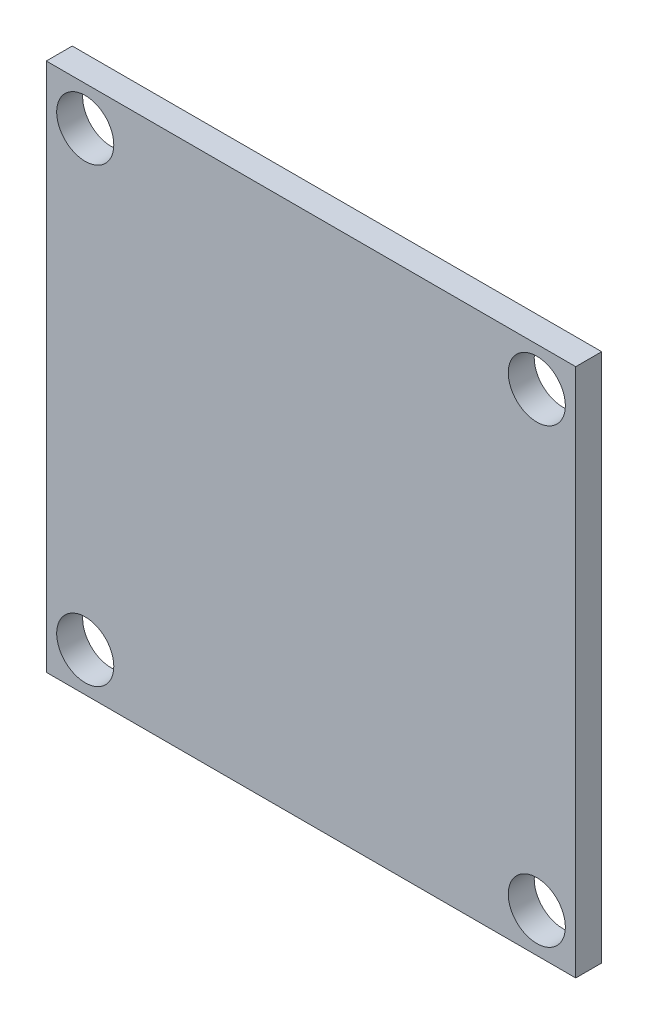
ISO-10303-21;
HEADER;
FILE_DESCRIPTION(('STEP AP214'),'2;1');
FILE_NAME('part.step','',(''),(''),'','','');
FILE_SCHEMA(('AUTOMOTIVE_DESIGN { 1 0 10303 214 1 1 1 1 }'));
ENDSEC;
DATA;
#1=APPLICATION_CONTEXT('core data for automotive mechanical design processes');
#2=APPLICATION_PROTOCOL_DEFINITION('international standard','automotive_design',2000,#1);
#3=PRODUCT_CONTEXT('',#1,'mechanical');
#4=PRODUCT('Part','Part','',(#3));
#5=PRODUCT_RELATED_PRODUCT_CATEGORY('part','',(#4));
#6=PRODUCT_DEFINITION_FORMATION('','',#4);
#7=PRODUCT_DEFINITION_CONTEXT('part definition',#1,'design');
#8=PRODUCT_DEFINITION('design','',#6,#7);
#9=PRODUCT_DEFINITION_SHAPE('','',#8);
#10=(LENGTH_UNIT() NAMED_UNIT(*) SI_UNIT(.MILLI.,.METRE.));
#11=(NAMED_UNIT(*) PLANE_ANGLE_UNIT() SI_UNIT($,.RADIAN.));
#12=(NAMED_UNIT(*) SI_UNIT($,.STERADIAN.) SOLID_ANGLE_UNIT());
#13=UNCERTAINTY_MEASURE_WITH_UNIT(LENGTH_MEASURE(1.E-05),#10,'distance_accuracy_value','');
#14=(GEOMETRIC_REPRESENTATION_CONTEXT(3) GLOBAL_UNCERTAINTY_ASSIGNED_CONTEXT((#13)) GLOBAL_UNIT_ASSIGNED_CONTEXT((#10,
#11,#12)) REPRESENTATION_CONTEXT('',''));
#15=CARTESIAN_POINT('',(0.,0.,0.));
#16=DIRECTION('',(0.,0.,1.));
#17=DIRECTION('',(1.,0.,0.));
#18=AXIS2_PLACEMENT_3D('',#15,#16,#17);
#19=CARTESIAN_POINT('',(25.908,-25.908,2.54));
#20=DIRECTION('',(-1.,0.,0.));
#21=DIRECTION('',(0.,0.,1.));
#22=AXIS2_PLACEMENT_3D('',#19,#20,#21);
#23=PLANE('',#22);
#24=DIRECTION('',(0.,1.,0.));
#25=VECTOR('',#24,1.);
#26=CARTESIAN_POINT('',(25.908,-25.908,0.));
#27=LINE('',#26,#25);
#28=CARTESIAN_POINT('',(25.908,-25.908,0.));
#29=VERTEX_POINT('',#28);
#30=CARTESIAN_POINT('',(25.908,25.908,0.));
#31=VERTEX_POINT('',#30);
#32=EDGE_CURVE('E99',#29,#31,#27,.T.);
#33=ORIENTED_EDGE('',*,*,#32,.T.);
#34=DIRECTION('',(0.,0.,-1.));
#35=VECTOR('',#34,1.);
#36=CARTESIAN_POINT('',(25.908,25.908,2.54));
#37=LINE('',#36,#35);
#38=CARTESIAN_POINT('',(25.908,25.908,2.54));
#39=VERTEX_POINT('',#38);
#40=EDGE_CURVE('E11',#39,#31,#37,.T.);
#41=ORIENTED_EDGE('',*,*,#40,.F.);
#42=DIRECTION('',(0.,1.,0.));
#43=VECTOR('',#42,1.);
#44=CARTESIAN_POINT('',(25.908,-25.908,2.54));
#45=LINE('',#44,#43);
#46=CARTESIAN_POINT('',(25.908,-25.908,2.54));
#47=VERTEX_POINT('',#46);
#48=EDGE_CURVE('E86',#47,#39,#45,.T.);
#49=ORIENTED_EDGE('',*,*,#48,.F.);
#50=DIRECTION('',(0.,0.,-1.));
#51=VECTOR('',#50,1.);
#52=CARTESIAN_POINT('',(25.908,-25.908,2.54));
#53=LINE('',#52,#51);
#54=EDGE_CURVE('E95',#47,#29,#53,.T.);
#55=ORIENTED_EDGE('',*,*,#54,.T.);
#56=EDGE_LOOP('',(#33,#41,#49,#55));
#57=FACE_BOUND('',#56,.T.);
#58=ADVANCED_FACE('F33',(#57),#23,.F.);
#59=CARTESIAN_POINT('',(-25.908,25.908,2.54));
#60=DIRECTION('',(0.,-1.,0.));
#61=DIRECTION('',(0.,0.,-1.));
#62=AXIS2_PLACEMENT_3D('',#59,#60,#61);
#63=PLANE('',#62);
#64=DIRECTION('',(-1.,0.,0.));
#65=VECTOR('',#64,1.);
#66=CARTESIAN_POINT('',(-25.908,25.908,0.));
#67=LINE('',#66,#65);
#68=CARTESIAN_POINT('',(-25.908,25.908,0.));
#69=VERTEX_POINT('',#68);
#70=EDGE_CURVE('E90',#31,#69,#67,.T.);
#71=ORIENTED_EDGE('',*,*,#70,.T.);
#72=DIRECTION('',(0.,0.,-1.));
#73=VECTOR('',#72,1.);
#74=CARTESIAN_POINT('',(-25.908,25.908,2.54));
#75=LINE('',#74,#73);
#76=CARTESIAN_POINT('',(-25.908,25.908,2.54));
#77=VERTEX_POINT('',#76);
#78=EDGE_CURVE('E42',#77,#69,#75,.T.);
#79=ORIENTED_EDGE('',*,*,#78,.F.);
#80=DIRECTION('',(-1.,0.,0.));
#81=VECTOR('',#80,1.);
#82=CARTESIAN_POINT('',(-25.908,25.908,2.54));
#83=LINE('',#82,#81);
#84=EDGE_CURVE('E81',#39,#77,#83,.T.);
#85=ORIENTED_EDGE('',*,*,#84,.F.);
#86=ORIENTED_EDGE('',*,*,#40,.T.);
#87=EDGE_LOOP('',(#71,#79,#85,#86));
#88=FACE_BOUND('',#87,.T.);
#89=ADVANCED_FACE('F89',(#88),#63,.F.);
#90=CARTESIAN_POINT('',(-25.908,-25.908,2.54));
#91=DIRECTION('',(1.,0.,0.));
#92=DIRECTION('',(0.,0.,-1.));
#93=AXIS2_PLACEMENT_3D('',#90,#91,#92);
#94=PLANE('',#93);
#95=DIRECTION('',(0.,-1.,0.));
#96=VECTOR('',#95,1.);
#97=CARTESIAN_POINT('',(-25.908,-25.908,0.));
#98=LINE('',#97,#96);
#99=CARTESIAN_POINT('',(-25.908,-25.908,0.));
#100=VERTEX_POINT('',#99);
#101=EDGE_CURVE('E68',#69,#100,#98,.T.);
#102=ORIENTED_EDGE('',*,*,#101,.T.);
#103=DIRECTION('',(0.,0.,-1.));
#104=VECTOR('',#103,1.);
#105=CARTESIAN_POINT('',(-25.908,-25.908,2.54));
#106=LINE('',#105,#104);
#107=CARTESIAN_POINT('',(-25.908,-25.908,2.54));
#108=VERTEX_POINT('',#107);
#109=EDGE_CURVE('E91',#108,#100,#106,.T.);
#110=ORIENTED_EDGE('',*,*,#109,.F.);
#111=DIRECTION('',(0.,-1.,0.));
#112=VECTOR('',#111,1.);
#113=CARTESIAN_POINT('',(-25.908,-25.908,2.54));
#114=LINE('',#113,#112);
#115=EDGE_CURVE('E84',#77,#108,#114,.T.);
#116=ORIENTED_EDGE('',*,*,#115,.F.);
#117=ORIENTED_EDGE('',*,*,#78,.T.);
#118=EDGE_LOOP('',(#102,#110,#116,#117));
#119=FACE_BOUND('',#118,.T.);
#120=ADVANCED_FACE('F93',(#119),#94,.F.);
#121=CARTESIAN_POINT('',(-25.908,-25.908,2.54));
#122=DIRECTION('',(0.,1.,0.));
#123=DIRECTION('',(0.,0.,1.));
#124=AXIS2_PLACEMENT_3D('',#121,#122,#123);
#125=PLANE('',#124);
#126=DIRECTION('',(1.,0.,0.));
#127=VECTOR('',#126,1.);
#128=CARTESIAN_POINT('',(-25.908,-25.908,0.));
#129=LINE('',#128,#127);
#130=EDGE_CURVE('E74',#100,#29,#129,.T.);
#131=ORIENTED_EDGE('',*,*,#130,.T.);
#132=ORIENTED_EDGE('',*,*,#54,.F.);
#133=DIRECTION('',(1.,0.,0.));
#134=VECTOR('',#133,1.);
#135=CARTESIAN_POINT('',(-25.908,-25.908,2.54));
#136=LINE('',#135,#134);
#137=EDGE_CURVE('E51',#108,#47,#136,.T.);
#138=ORIENTED_EDGE('',*,*,#137,.F.);
#139=ORIENTED_EDGE('',*,*,#109,.T.);
#140=EDGE_LOOP('',(#131,#132,#138,#139));
#141=FACE_BOUND('',#140,.T.);
#142=ADVANCED_FACE('F140',(#141),#125,.F.);
#143=CARTESIAN_POINT('',(0.,0.,2.54));
#144=DIRECTION('',(0.,0.,-1.));
#145=DIRECTION('',(-1.,0.,0.));
#146=AXIS2_PLACEMENT_3D('',#143,#144,#145);
#147=PLANE('',#146);
#148=CARTESIAN_POINT('',(-22.098,22.098,2.54));
#149=DIRECTION('',(0.,0.,1.));
#150=DIRECTION('',(1.,0.,0.));
#151=AXIS2_PLACEMENT_3D('',#148,#149,#150);
#152=CIRCLE('',#151,2.794);
#153=CARTESIAN_POINT('',(-19.304,22.098,2.54));
#154=VERTEX_POINT('',#153);
#155=EDGE_CURVE('E114',#154,#154,#152,.T.);
#156=ORIENTED_EDGE('',*,*,#155,.F.);
#157=EDGE_LOOP('',(#156));
#158=FACE_BOUND('',#157,.T.);
#159=CARTESIAN_POINT('',(-22.098,-22.098,2.54));
#160=DIRECTION('',(0.,0.,1.));
#161=DIRECTION('',(1.,0.,0.));
#162=AXIS2_PLACEMENT_3D('',#159,#160,#161);
#163=CIRCLE('',#162,2.794);
#164=CARTESIAN_POINT('',(-19.304,-22.098,2.54));
#165=VERTEX_POINT('',#164);
#166=EDGE_CURVE('E129',#165,#165,#163,.T.);
#167=ORIENTED_EDGE('',*,*,#166,.F.);
#168=EDGE_LOOP('',(#167));
#169=FACE_BOUND('',#168,.T.);
#170=CARTESIAN_POINT('',(22.098,-22.098,2.54));
#171=DIRECTION('',(0.,0.,1.));
#172=DIRECTION('',(1.,0.,0.));
#173=AXIS2_PLACEMENT_3D('',#170,#171,#172);
#174=CIRCLE('',#173,2.794);
#175=CARTESIAN_POINT('',(24.892,-22.098,2.54));
#176=VERTEX_POINT('',#175);
#177=EDGE_CURVE('E126',#176,#176,#174,.T.);
#178=ORIENTED_EDGE('',*,*,#177,.F.);
#179=EDGE_LOOP('',(#178));
#180=FACE_BOUND('',#179,.T.);
#181=CARTESIAN_POINT('',(22.098,22.098,2.54));
#182=DIRECTION('',(0.,0.,1.));
#183=DIRECTION('',(1.,0.,0.));
#184=AXIS2_PLACEMENT_3D('',#181,#182,#183);
#185=CIRCLE('',#184,2.794);
#186=CARTESIAN_POINT('',(24.892,22.098,2.54));
#187=VERTEX_POINT('',#186);
#188=EDGE_CURVE('E110',#187,#187,#185,.T.);
#189=ORIENTED_EDGE('',*,*,#188,.F.);
#190=EDGE_LOOP('',(#189));
#191=FACE_BOUND('',#190,.T.);
#192=ORIENTED_EDGE('',*,*,#48,.T.);
#193=ORIENTED_EDGE('',*,*,#84,.T.);
#194=ORIENTED_EDGE('',*,*,#115,.T.);
#195=ORIENTED_EDGE('',*,*,#137,.T.);
#196=EDGE_LOOP('',(#192,#193,#194,#195));
#197=FACE_BOUND('',#196,.T.);
#198=ADVANCED_FACE('F82',(#158,#169,#180,#191,#197),#147,.F.);
#199=CARTESIAN_POINT('',(0.,0.,0.));
#200=DIRECTION('',(0.,0.,-1.));
#201=DIRECTION('',(-1.,0.,0.));
#202=AXIS2_PLACEMENT_3D('',#199,#200,#201);
#203=PLANE('',#202);
#204=CARTESIAN_POINT('',(-22.098,22.098,0.));
#205=DIRECTION('',(0.,0.,-1.));
#206=DIRECTION('',(-1.,0.,0.));
#207=AXIS2_PLACEMENT_3D('',#204,#205,#206);
#208=CIRCLE('',#207,2.794);
#209=CARTESIAN_POINT('',(-24.892,22.098,0.));
#210=VERTEX_POINT('',#209);
#211=EDGE_CURVE('E36',#210,#210,#208,.T.);
#212=ORIENTED_EDGE('',*,*,#211,.F.);
#213=EDGE_LOOP('',(#212));
#214=FACE_BOUND('',#213,.T.);
#215=CARTESIAN_POINT('',(-22.098,-22.098,0.));
#216=DIRECTION('',(0.,0.,-1.));
#217=DIRECTION('',(-1.,0.,0.));
#218=AXIS2_PLACEMENT_3D('',#215,#216,#217);
#219=CIRCLE('',#218,2.794);
#220=CARTESIAN_POINT('',(-24.892,-22.098,0.));
#221=VERTEX_POINT('',#220);
#222=EDGE_CURVE('E113',#221,#221,#219,.T.);
#223=ORIENTED_EDGE('',*,*,#222,.F.);
#224=EDGE_LOOP('',(#223));
#225=FACE_BOUND('',#224,.T.);
#226=CARTESIAN_POINT('',(22.098,-22.098,0.));
#227=DIRECTION('',(0.,0.,-1.));
#228=DIRECTION('',(-1.,0.,0.));
#229=AXIS2_PLACEMENT_3D('',#226,#227,#228);
#230=CIRCLE('',#229,2.794);
#231=CARTESIAN_POINT('',(19.304,-22.098,0.));
#232=VERTEX_POINT('',#231);
#233=EDGE_CURVE('E111',#232,#232,#230,.T.);
#234=ORIENTED_EDGE('',*,*,#233,.F.);
#235=EDGE_LOOP('',(#234));
#236=FACE_BOUND('',#235,.T.);
#237=CARTESIAN_POINT('',(22.098,22.098,0.));
#238=DIRECTION('',(0.,0.,-1.));
#239=DIRECTION('',(-1.,0.,0.));
#240=AXIS2_PLACEMENT_3D('',#237,#238,#239);
#241=CIRCLE('',#240,2.794);
#242=CARTESIAN_POINT('',(19.304,22.098,0.));
#243=VERTEX_POINT('',#242);
#244=EDGE_CURVE('E102',#243,#243,#241,.T.);
#245=ORIENTED_EDGE('',*,*,#244,.F.);
#246=EDGE_LOOP('',(#245));
#247=FACE_BOUND('',#246,.T.);
#248=ORIENTED_EDGE('',*,*,#32,.F.);
#249=ORIENTED_EDGE('',*,*,#130,.F.);
#250=ORIENTED_EDGE('',*,*,#101,.F.);
#251=ORIENTED_EDGE('',*,*,#70,.F.);
#252=EDGE_LOOP('',(#248,#249,#250,#251));
#253=FACE_BOUND('',#252,.T.);
#254=ADVANCED_FACE('F139',(#214,#225,#236,#247,#253),#203,.T.);
#255=CARTESIAN_POINT('',(22.098,22.098,-2.54));
#256=DIRECTION('',(0.,0.,1.));
#257=DIRECTION('',(1.,0.,0.));
#258=AXIS2_PLACEMENT_3D('',#255,#256,#257);
#259=CYLINDRICAL_SURFACE('',#258,2.794);
#260=ORIENTED_EDGE('',*,*,#244,.T.);
#261=EDGE_LOOP('',(#260));
#262=FACE_BOUND('',#261,.T.);
#263=ORIENTED_EDGE('',*,*,#188,.T.);
#264=EDGE_LOOP('',(#263));
#265=FACE_BOUND('',#264,.T.);
#266=ADVANCED_FACE('F150',(#262,#265),#259,.F.);
#267=CARTESIAN_POINT('',(22.098,-22.098,-2.54));
#268=DIRECTION('',(0.,0.,1.));
#269=DIRECTION('',(1.,0.,0.));
#270=AXIS2_PLACEMENT_3D('',#267,#268,#269);
#271=CYLINDRICAL_SURFACE('',#270,2.794);
#272=ORIENTED_EDGE('',*,*,#233,.T.);
#273=EDGE_LOOP('',(#272));
#274=FACE_BOUND('',#273,.T.);
#275=ORIENTED_EDGE('',*,*,#177,.T.);
#276=EDGE_LOOP('',(#275));
#277=FACE_BOUND('',#276,.T.);
#278=ADVANCED_FACE('F147',(#274,#277),#271,.F.);
#279=CARTESIAN_POINT('',(-22.098,-22.098,-2.54));
#280=DIRECTION('',(0.,0.,1.));
#281=DIRECTION('',(1.,0.,0.));
#282=AXIS2_PLACEMENT_3D('',#279,#280,#281);
#283=CYLINDRICAL_SURFACE('',#282,2.794);
#284=ORIENTED_EDGE('',*,*,#222,.T.);
#285=EDGE_LOOP('',(#284));
#286=FACE_BOUND('',#285,.T.);
#287=ORIENTED_EDGE('',*,*,#166,.T.);
#288=EDGE_LOOP('',(#287));
#289=FACE_BOUND('',#288,.T.);
#290=ADVANCED_FACE('F149',(#286,#289),#283,.F.);
#291=CARTESIAN_POINT('',(-22.098,22.098,-2.54));
#292=DIRECTION('',(0.,0.,1.));
#293=DIRECTION('',(1.,0.,0.));
#294=AXIS2_PLACEMENT_3D('',#291,#292,#293);
#295=CYLINDRICAL_SURFACE('',#294,2.794);
#296=ORIENTED_EDGE('',*,*,#211,.T.);
#297=EDGE_LOOP('',(#296));
#298=FACE_BOUND('',#297,.T.);
#299=ORIENTED_EDGE('',*,*,#155,.T.);
#300=EDGE_LOOP('',(#299));
#301=FACE_BOUND('',#300,.T.);
#302=ADVANCED_FACE('F135',(#298,#301),#295,.F.);
#303=CLOSED_SHELL('',(#58,#89,#120,#142,#198,#254,#266,#278,#290,#302));
#304=MANIFOLD_SOLID_BREP('B2',#303);
#305=ADVANCED_BREP_SHAPE_REPRESENTATION('',(#18,#304),#14);
#306=SHAPE_DEFINITION_REPRESENTATION(#9,#305);
ENDSEC;
END-ISO-10303-21;
